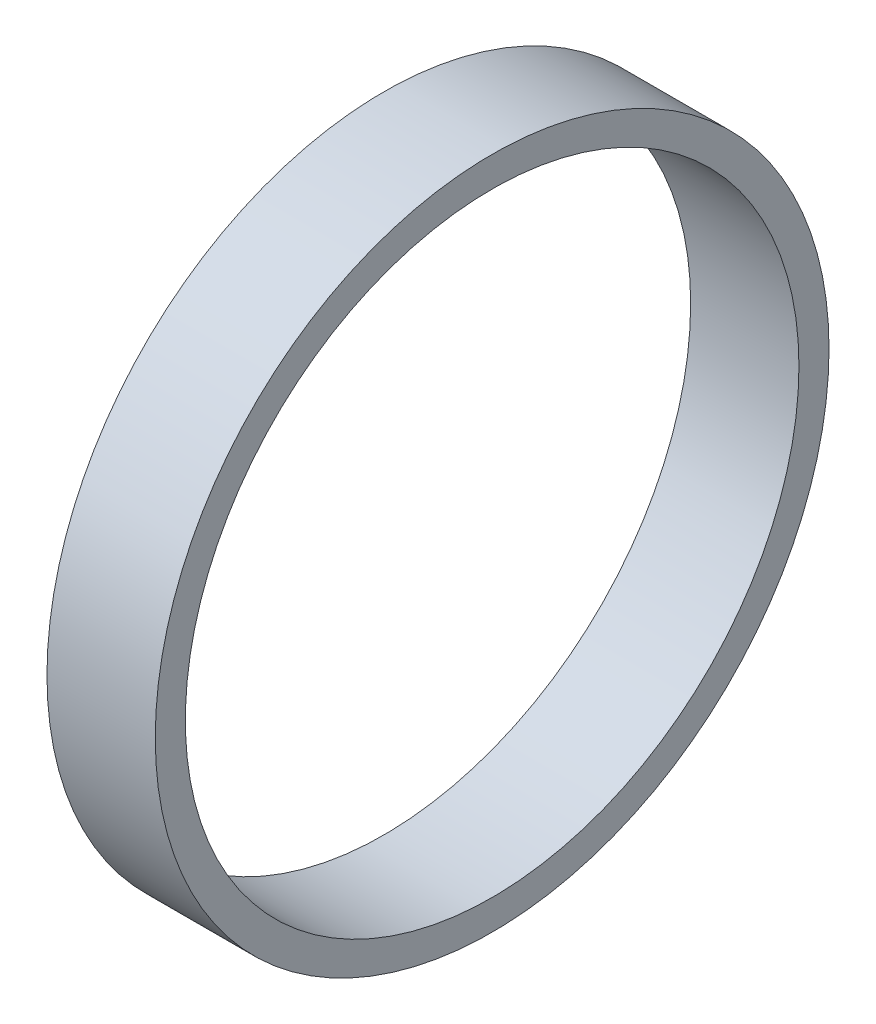
ISO-10303-21;
HEADER;
FILE_DESCRIPTION(('STEP AP214'),'2;1');
FILE_NAME('part.step','',(''),(''),'','','');
FILE_SCHEMA(('AUTOMOTIVE_DESIGN { 1 0 10303 214 1 1 1 1 }'));
ENDSEC;
DATA;
#1=APPLICATION_CONTEXT('core data for automotive mechanical design processes');
#2=APPLICATION_PROTOCOL_DEFINITION('international standard','automotive_design',2000,#1);
#3=PRODUCT_CONTEXT('',#1,'mechanical');
#4=PRODUCT('Part','Part','',(#3));
#5=PRODUCT_RELATED_PRODUCT_CATEGORY('part','',(#4));
#6=PRODUCT_DEFINITION_FORMATION('','',#4);
#7=PRODUCT_DEFINITION_CONTEXT('part definition',#1,'design');
#8=PRODUCT_DEFINITION('design','',#6,#7);
#9=PRODUCT_DEFINITION_SHAPE('','',#8);
#10=(LENGTH_UNIT() NAMED_UNIT(*) SI_UNIT(.MILLI.,.METRE.));
#11=(NAMED_UNIT(*) PLANE_ANGLE_UNIT() SI_UNIT($,.RADIAN.));
#12=(NAMED_UNIT(*) SI_UNIT($,.STERADIAN.) SOLID_ANGLE_UNIT());
#13=UNCERTAINTY_MEASURE_WITH_UNIT(LENGTH_MEASURE(1.E-05),#10,'distance_accuracy_value','');
#14=(GEOMETRIC_REPRESENTATION_CONTEXT(3) GLOBAL_UNCERTAINTY_ASSIGNED_CONTEXT((#13)) GLOBAL_UNIT_ASSIGNED_CONTEXT((#10,
#11,#12)) REPRESENTATION_CONTEXT('',''));
#15=CARTESIAN_POINT('',(0.,0.,0.));
#16=DIRECTION('',(0.,0.,1.));
#17=DIRECTION('',(1.,0.,0.));
#18=AXIS2_PLACEMENT_3D('',#15,#16,#17);
#19=CARTESIAN_POINT('',(1.8,0.,0.));
#20=DIRECTION('',(1.,0.,0.));
#21=DIRECTION('',(0.,0.,-1.));
#22=AXIS2_PLACEMENT_3D('',#19,#20,#21);
#23=PLANE('',#22);
#24=CARTESIAN_POINT('',(1.8,0.,0.));
#25=DIRECTION('',(1.,0.,0.));
#26=DIRECTION('',(0.,0.,-1.));
#27=AXIS2_PLACEMENT_3D('',#24,#25,#26);
#28=CIRCLE('',#27,5.6);
#29=CARTESIAN_POINT('',(1.8,0.,-5.6));
#30=VERTEX_POINT('',#29);
#31=EDGE_CURVE('E10',#30,#30,#28,.T.);
#32=ORIENTED_EDGE('',*,*,#31,.T.);
#33=EDGE_LOOP('',(#32));
#34=FACE_BOUND('',#33,.T.);
#35=CARTESIAN_POINT('',(1.8,0.,0.));
#36=DIRECTION('',(1.,0.,0.));
#37=DIRECTION('',(0.,0.,-1.));
#38=AXIS2_PLACEMENT_3D('',#35,#36,#37);
#39=CIRCLE('',#38,5.1);
#40=CARTESIAN_POINT('',(1.8,0.,-5.1));
#41=VERTEX_POINT('',#40);
#42=EDGE_CURVE('E50',#41,#41,#39,.T.);
#43=ORIENTED_EDGE('',*,*,#42,.F.);
#44=EDGE_LOOP('',(#43));
#45=FACE_BOUND('',#44,.T.);
#46=ADVANCED_FACE('F39',(#34,#45),#23,.T.);
#47=CARTESIAN_POINT('',(0.,0.,0.));
#48=DIRECTION('',(1.,0.,0.));
#49=DIRECTION('',(0.,0.,-1.));
#50=AXIS2_PLACEMENT_3D('',#47,#48,#49);
#51=PLANE('',#50);
#52=CARTESIAN_POINT('',(0.,0.,0.));
#53=DIRECTION('',(1.,0.,0.));
#54=DIRECTION('',(0.,0.,-1.));
#55=AXIS2_PLACEMENT_3D('',#52,#53,#54);
#56=CIRCLE('',#55,5.6);
#57=CARTESIAN_POINT('',(0.,0.,-5.6));
#58=VERTEX_POINT('',#57);
#59=EDGE_CURVE('E43',#58,#58,#56,.T.);
#60=ORIENTED_EDGE('',*,*,#59,.F.);
#61=EDGE_LOOP('',(#60));
#62=FACE_BOUND('',#61,.T.);
#63=CARTESIAN_POINT('',(0.,0.,0.));
#64=DIRECTION('',(1.,0.,0.));
#65=DIRECTION('',(0.,0.,-1.));
#66=AXIS2_PLACEMENT_3D('',#63,#64,#65);
#67=CIRCLE('',#66,5.1);
#68=CARTESIAN_POINT('',(0.,0.,-5.1));
#69=VERTEX_POINT('',#68);
#70=EDGE_CURVE('E52',#69,#69,#67,.T.);
#71=ORIENTED_EDGE('',*,*,#70,.T.);
#72=EDGE_LOOP('',(#71));
#73=FACE_BOUND('',#72,.T.);
#74=ADVANCED_FACE('F62',(#62,#73),#51,.F.);
#75=CARTESIAN_POINT('',(1.8,0.,0.));
#76=DIRECTION('',(-1.,0.,0.));
#77=DIRECTION('',(0.,0.,1.));
#78=AXIS2_PLACEMENT_3D('',#75,#76,#77);
#79=CYLINDRICAL_SURFACE('',#78,5.6);
#80=ORIENTED_EDGE('',*,*,#31,.F.);
#81=EDGE_LOOP('',(#80));
#82=FACE_BOUND('',#81,.T.);
#83=ORIENTED_EDGE('',*,*,#59,.T.);
#84=EDGE_LOOP('',(#83));
#85=FACE_BOUND('',#84,.T.);
#86=ADVANCED_FACE('F41',(#82,#85),#79,.T.);
#87=CARTESIAN_POINT('',(1.8,0.,0.));
#88=DIRECTION('',(-1.,0.,0.));
#89=DIRECTION('',(0.,0.,1.));
#90=AXIS2_PLACEMENT_3D('',#87,#88,#89);
#91=CYLINDRICAL_SURFACE('',#90,5.1);
#92=ORIENTED_EDGE('',*,*,#42,.T.);
#93=EDGE_LOOP('',(#92));
#94=FACE_BOUND('',#93,.T.);
#95=ORIENTED_EDGE('',*,*,#70,.F.);
#96=EDGE_LOOP('',(#95));
#97=FACE_BOUND('',#96,.T.);
#98=ADVANCED_FACE('F58',(#94,#97),#91,.F.);
#99=CLOSED_SHELL('',(#46,#74,#86,#98));
#100=MANIFOLD_SOLID_BREP('B2',#99);
#101=ADVANCED_BREP_SHAPE_REPRESENTATION('',(#18,#100),#14);
#102=SHAPE_DEFINITION_REPRESENTATION(#9,#101);
ENDSEC;
END-ISO-10303-21;
